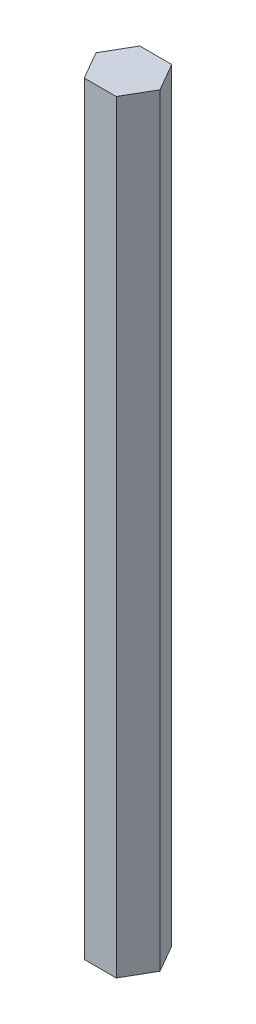
ISO-10303-21;
HEADER;
FILE_DESCRIPTION(('STEP AP214'),'2;1');
FILE_NAME('part.step','',(''),(''),'','','');
FILE_SCHEMA(('AUTOMOTIVE_DESIGN { 1 0 10303 214 1 1 1 1 }'));
ENDSEC;
DATA;
#1=APPLICATION_CONTEXT('core data for automotive mechanical design processes');
#2=APPLICATION_PROTOCOL_DEFINITION('international standard','automotive_design',2000,#1);
#3=PRODUCT_CONTEXT('',#1,'mechanical');
#4=PRODUCT('Part','Part','',(#3));
#5=PRODUCT_RELATED_PRODUCT_CATEGORY('part','',(#4));
#6=PRODUCT_DEFINITION_FORMATION('','',#4);
#7=PRODUCT_DEFINITION_CONTEXT('part definition',#1,'design');
#8=PRODUCT_DEFINITION('design','',#6,#7);
#9=PRODUCT_DEFINITION_SHAPE('','',#8);
#10=(LENGTH_UNIT() NAMED_UNIT(*) SI_UNIT(.MILLI.,.METRE.));
#11=(NAMED_UNIT(*) PLANE_ANGLE_UNIT() SI_UNIT($,.RADIAN.));
#12=(NAMED_UNIT(*) SI_UNIT($,.STERADIAN.) SOLID_ANGLE_UNIT());
#13=UNCERTAINTY_MEASURE_WITH_UNIT(LENGTH_MEASURE(1.E-05),#10,'distance_accuracy_value','');
#14=(GEOMETRIC_REPRESENTATION_CONTEXT(3) GLOBAL_UNCERTAINTY_ASSIGNED_CONTEXT((#13)) GLOBAL_UNIT_ASSIGNED_CONTEXT((#10,
#11,#12)) REPRESENTATION_CONTEXT('',''));
#15=CARTESIAN_POINT('',(0.,0.,0.));
#16=DIRECTION('',(0.,0.,1.));
#17=DIRECTION('',(1.,0.,0.));
#18=AXIS2_PLACEMENT_3D('',#15,#16,#17);
#19=CARTESIAN_POINT('',(4.195,-100.,0.));
#20=DIRECTION('',(0.866025403784439,0.,-0.5));
#21=DIRECTION('',(-0.5,0.,-0.866025403784439));
#22=AXIS2_PLACEMENT_3D('',#19,#20,#21);
#23=PLANE('',#22);
#24=DIRECTION('',(-0.5,0.,-0.866025403784439));
#25=VECTOR('',#24,1.);
#26=CARTESIAN_POINT('',(4.195,0.,0.));
#27=LINE('',#26,#25);
#28=CARTESIAN_POINT('',(4.195,0.,0.));
#29=VERTEX_POINT('',#28);
#30=CARTESIAN_POINT('',(2.0975,0.,-3.63297656887572));
#31=VERTEX_POINT('',#30);
#32=EDGE_CURVE('E130',#29,#31,#27,.T.);
#33=ORIENTED_EDGE('',*,*,#32,.F.);
#34=DIRECTION('',(0.,1.,0.));
#35=VECTOR('',#34,1.);
#36=CARTESIAN_POINT('',(4.195,-100.,0.));
#37=LINE('',#36,#35);
#38=CARTESIAN_POINT('',(4.195,-100.,0.));
#39=VERTEX_POINT('',#38);
#40=EDGE_CURVE('E11',#39,#29,#37,.T.);
#41=ORIENTED_EDGE('',*,*,#40,.F.);
#42=DIRECTION('',(-0.5,0.,-0.866025403784439));
#43=VECTOR('',#42,1.);
#44=CARTESIAN_POINT('',(4.195,-100.,0.));
#45=LINE('',#44,#43);
#46=CARTESIAN_POINT('',(2.0975,-100.,-3.63297656887572));
#47=VERTEX_POINT('',#46);
#48=EDGE_CURVE('E150',#39,#47,#45,.T.);
#49=ORIENTED_EDGE('',*,*,#48,.T.);
#50=DIRECTION('',(0.,1.,0.));
#51=VECTOR('',#50,1.);
#52=CARTESIAN_POINT('',(2.0975,-100.,-3.63297656887572));
#53=LINE('',#52,#51);
#54=EDGE_CURVE('E42',#47,#31,#53,.T.);
#55=ORIENTED_EDGE('',*,*,#54,.T.);
#56=EDGE_LOOP('',(#33,#41,#49,#55));
#57=FACE_BOUND('',#56,.T.);
#58=ADVANCED_FACE('F39',(#57),#23,.T.);
#59=CARTESIAN_POINT('',(2.0975,-100.,3.63297656887572));
#60=DIRECTION('',(0.866025403784438,0.,0.5));
#61=DIRECTION('',(0.5,0.,-0.866025403784439));
#62=AXIS2_PLACEMENT_3D('',#59,#60,#61);
#63=PLANE('',#62);
#64=DIRECTION('',(0.5,0.,-0.866025403784438));
#65=VECTOR('',#64,1.);
#66=CARTESIAN_POINT('',(2.0975,0.,3.63297656887572));
#67=LINE('',#66,#65);
#68=CARTESIAN_POINT('',(2.0975,0.,3.63297656887572));
#69=VERTEX_POINT('',#68);
#70=EDGE_CURVE('E147',#69,#29,#67,.T.);
#71=ORIENTED_EDGE('',*,*,#70,.F.);
#72=DIRECTION('',(0.,1.,0.));
#73=VECTOR('',#72,1.);
#74=CARTESIAN_POINT('',(2.0975,-100.,3.63297656887572));
#75=LINE('',#74,#73);
#76=CARTESIAN_POINT('',(2.0975,-100.,3.63297656887572));
#77=VERTEX_POINT('',#76);
#78=EDGE_CURVE('E49',#77,#69,#75,.T.);
#79=ORIENTED_EDGE('',*,*,#78,.F.);
#80=DIRECTION('',(0.5,0.,-0.866025403784438));
#81=VECTOR('',#80,1.);
#82=CARTESIAN_POINT('',(2.0975,-100.,3.63297656887572));
#83=LINE('',#82,#81);
#84=EDGE_CURVE('E116',#77,#39,#83,.T.);
#85=ORIENTED_EDGE('',*,*,#84,.T.);
#86=ORIENTED_EDGE('',*,*,#40,.T.);
#87=EDGE_LOOP('',(#71,#79,#85,#86));
#88=FACE_BOUND('',#87,.T.);
#89=ADVANCED_FACE('F162',(#88),#63,.T.);
#90=CARTESIAN_POINT('',(-2.0975,-100.,3.63297656887572));
#91=DIRECTION('',(0.,0.,1.));
#92=DIRECTION('',(1.,0.,0.));
#93=AXIS2_PLACEMENT_3D('',#90,#91,#92);
#94=PLANE('',#93);
#95=DIRECTION('',(1.,0.,0.));
#96=VECTOR('',#95,1.);
#97=CARTESIAN_POINT('',(-2.0975,0.,3.63297656887572));
#98=LINE('',#97,#96);
#99=CARTESIAN_POINT('',(-2.0975,0.,3.63297656887572));
#100=VERTEX_POINT('',#99);
#101=EDGE_CURVE('E102',#100,#69,#98,.T.);
#102=ORIENTED_EDGE('',*,*,#101,.F.);
#103=DIRECTION('',(0.,1.,0.));
#104=VECTOR('',#103,1.);
#105=CARTESIAN_POINT('',(-2.0975,-100.,3.63297656887572));
#106=LINE('',#105,#104);
#107=CARTESIAN_POINT('',(-2.0975,-100.,3.63297656887572));
#108=VERTEX_POINT('',#107);
#109=EDGE_CURVE('E97',#108,#100,#106,.T.);
#110=ORIENTED_EDGE('',*,*,#109,.F.);
#111=DIRECTION('',(1.,0.,0.));
#112=VECTOR('',#111,1.);
#113=CARTESIAN_POINT('',(-2.0975,-100.,3.63297656887572));
#114=LINE('',#113,#112);
#115=EDGE_CURVE('E100',#108,#77,#114,.T.);
#116=ORIENTED_EDGE('',*,*,#115,.T.);
#117=ORIENTED_EDGE('',*,*,#78,.T.);
#118=EDGE_LOOP('',(#102,#110,#116,#117));
#119=FACE_BOUND('',#118,.T.);
#120=ADVANCED_FACE('F99',(#119),#94,.T.);
#121=CARTESIAN_POINT('',(-4.195,-100.,0.));
#122=DIRECTION('',(-0.866025403784439,0.,0.5));
#123=DIRECTION('',(0.5,0.,0.866025403784439));
#124=AXIS2_PLACEMENT_3D('',#121,#122,#123);
#125=PLANE('',#124);
#126=DIRECTION('',(0.5,0.,0.866025403784439));
#127=VECTOR('',#126,1.);
#128=CARTESIAN_POINT('',(-4.195,0.,0.));
#129=LINE('',#128,#127);
#130=CARTESIAN_POINT('',(-4.195,0.,0.));
#131=VERTEX_POINT('',#130);
#132=EDGE_CURVE('E142',#131,#100,#129,.T.);
#133=ORIENTED_EDGE('',*,*,#132,.F.);
#134=DIRECTION('',(0.,1.,0.));
#135=VECTOR('',#134,1.);
#136=CARTESIAN_POINT('',(-4.195,-100.,0.));
#137=LINE('',#136,#135);
#138=CARTESIAN_POINT('',(-4.195,-100.,0.));
#139=VERTEX_POINT('',#138);
#140=EDGE_CURVE('E108',#139,#131,#137,.T.);
#141=ORIENTED_EDGE('',*,*,#140,.F.);
#142=DIRECTION('',(0.5,0.,0.866025403784439));
#143=VECTOR('',#142,1.);
#144=CARTESIAN_POINT('',(-4.195,-100.,0.));
#145=LINE('',#144,#143);
#146=EDGE_CURVE('E114',#139,#108,#145,.T.);
#147=ORIENTED_EDGE('',*,*,#146,.T.);
#148=ORIENTED_EDGE('',*,*,#109,.T.);
#149=EDGE_LOOP('',(#133,#141,#147,#148));
#150=FACE_BOUND('',#149,.T.);
#151=ADVANCED_FACE('F119',(#150),#125,.T.);
#152=CARTESIAN_POINT('',(-2.0975,-100.,-3.63297656887572));
#153=DIRECTION('',(-0.866025403784439,0.,-0.5));
#154=DIRECTION('',(-0.5,0.,0.866025403784439));
#155=AXIS2_PLACEMENT_3D('',#152,#153,#154);
#156=PLANE('',#155);
#157=DIRECTION('',(-0.5,0.,0.866025403784439));
#158=VECTOR('',#157,1.);
#159=CARTESIAN_POINT('',(-2.0975,0.,-3.63297656887572));
#160=LINE('',#159,#158);
#161=CARTESIAN_POINT('',(-2.0975,0.,-3.63297656887572));
#162=VERTEX_POINT('',#161);
#163=EDGE_CURVE('E138',#162,#131,#160,.T.);
#164=ORIENTED_EDGE('',*,*,#163,.F.);
#165=DIRECTION('',(0.,1.,0.));
#166=VECTOR('',#165,1.);
#167=CARTESIAN_POINT('',(-2.0975,-100.,-3.63297656887572));
#168=LINE('',#167,#166);
#169=CARTESIAN_POINT('',(-2.0975,-100.,-3.63297656887572));
#170=VERTEX_POINT('',#169);
#171=EDGE_CURVE('E155',#170,#162,#168,.T.);
#172=ORIENTED_EDGE('',*,*,#171,.F.);
#173=DIRECTION('',(-0.5,0.,0.866025403784439));
#174=VECTOR('',#173,1.);
#175=CARTESIAN_POINT('',(-2.0975,-100.,-3.63297656887572));
#176=LINE('',#175,#174);
#177=EDGE_CURVE('E121',#170,#139,#176,.T.);
#178=ORIENTED_EDGE('',*,*,#177,.T.);
#179=ORIENTED_EDGE('',*,*,#140,.T.);
#180=EDGE_LOOP('',(#164,#172,#178,#179));
#181=FACE_BOUND('',#180,.T.);
#182=ADVANCED_FACE('F175',(#181),#156,.T.);
#183=CARTESIAN_POINT('',(2.0975,-100.,-3.63297656887572));
#184=DIRECTION('',(0.,0.,-1.));
#185=DIRECTION('',(-1.,0.,0.));
#186=AXIS2_PLACEMENT_3D('',#183,#184,#185);
#187=PLANE('',#186);
#188=DIRECTION('',(-1.,0.,0.));
#189=VECTOR('',#188,1.);
#190=CARTESIAN_POINT('',(2.0975,0.,-3.63297656887572));
#191=LINE('',#190,#189);
#192=EDGE_CURVE('E134',#31,#162,#191,.T.);
#193=ORIENTED_EDGE('',*,*,#192,.F.);
#194=ORIENTED_EDGE('',*,*,#54,.F.);
#195=DIRECTION('',(-1.,0.,0.));
#196=VECTOR('',#195,1.);
#197=CARTESIAN_POINT('',(2.0975,-100.,-3.63297656887572));
#198=LINE('',#197,#196);
#199=EDGE_CURVE('E124',#47,#170,#198,.T.);
#200=ORIENTED_EDGE('',*,*,#199,.T.);
#201=ORIENTED_EDGE('',*,*,#171,.T.);
#202=EDGE_LOOP('',(#193,#194,#200,#201));
#203=FACE_BOUND('',#202,.T.);
#204=ADVANCED_FACE('F159',(#203),#187,.T.);
#205=CARTESIAN_POINT('',(0.,-100.,0.));
#206=DIRECTION('',(0.,1.,0.));
#207=DIRECTION('',(0.,0.,1.));
#208=AXIS2_PLACEMENT_3D('',#205,#206,#207);
#209=PLANE('',#208);
#210=ORIENTED_EDGE('',*,*,#48,.F.);
#211=ORIENTED_EDGE('',*,*,#84,.F.);
#212=ORIENTED_EDGE('',*,*,#115,.F.);
#213=ORIENTED_EDGE('',*,*,#146,.F.);
#214=ORIENTED_EDGE('',*,*,#177,.F.);
#215=ORIENTED_EDGE('',*,*,#199,.F.);
#216=EDGE_LOOP('',(#210,#211,#212,#213,#214,#215));
#217=FACE_BOUND('',#216,.T.);
#218=ADVANCED_FACE('F112',(#217),#209,.F.);
#219=CARTESIAN_POINT('',(0.,0.,0.));
#220=DIRECTION('',(0.,1.,0.));
#221=DIRECTION('',(0.,0.,1.));
#222=AXIS2_PLACEMENT_3D('',#219,#220,#221);
#223=PLANE('',#222);
#224=ORIENTED_EDGE('',*,*,#32,.T.);
#225=ORIENTED_EDGE('',*,*,#192,.T.);
#226=ORIENTED_EDGE('',*,*,#163,.T.);
#227=ORIENTED_EDGE('',*,*,#132,.T.);
#228=ORIENTED_EDGE('',*,*,#101,.T.);
#229=ORIENTED_EDGE('',*,*,#70,.T.);
#230=EDGE_LOOP('',(#224,#225,#226,#227,#228,#229));
#231=FACE_BOUND('',#230,.T.);
#232=ADVANCED_FACE('F161',(#231),#223,.T.);
#233=CLOSED_SHELL('',(#58,#89,#120,#151,#182,#204,#218,#232));
#234=MANIFOLD_SOLID_BREP('B2',#233);
#235=ADVANCED_BREP_SHAPE_REPRESENTATION('',(#18,#234),#14);
#236=SHAPE_DEFINITION_REPRESENTATION(#9,#235);
ENDSEC;
END-ISO-10303-21;
